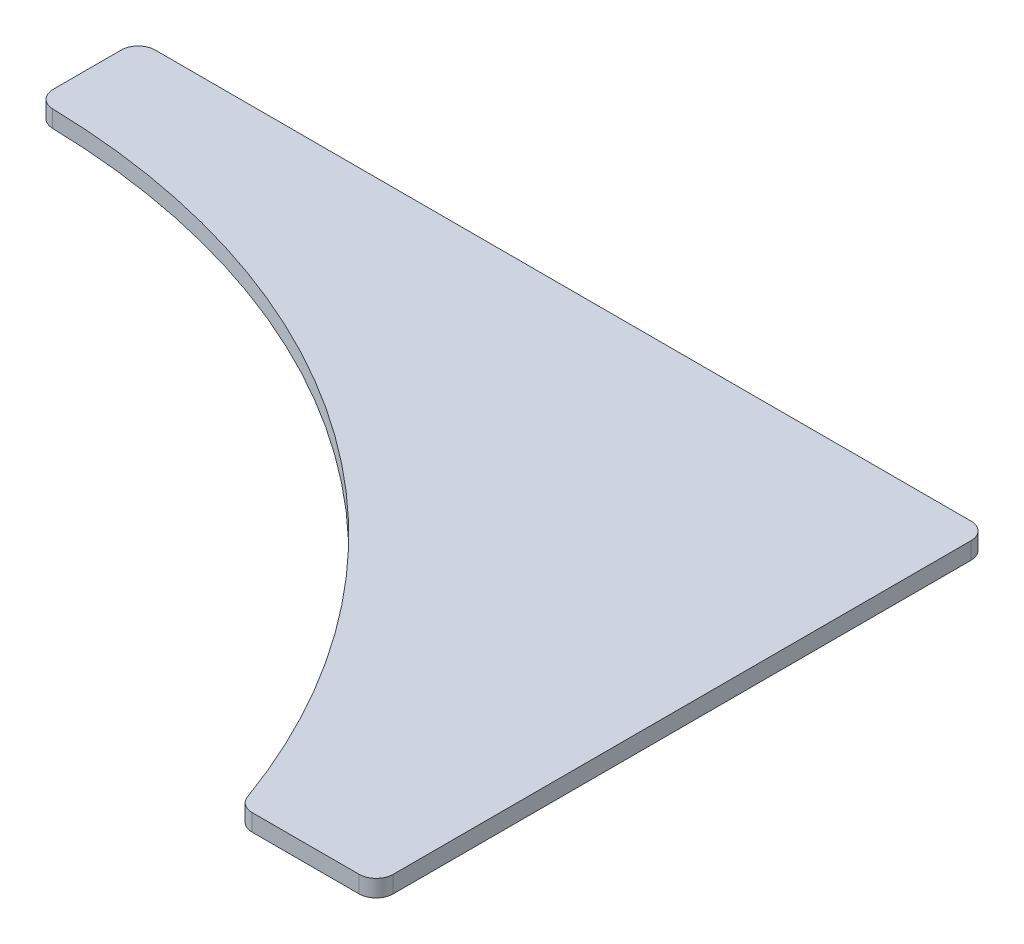
ISO-10303-21;
HEADER;
FILE_DESCRIPTION(('STEP AP214'),'2;1');
FILE_NAME('part.step','',(''),(''),'','','');
FILE_SCHEMA(('AUTOMOTIVE_DESIGN { 1 0 10303 214 1 1 1 1 }'));
ENDSEC;
DATA;
#1=APPLICATION_CONTEXT('core data for automotive mechanical design processes');
#2=APPLICATION_PROTOCOL_DEFINITION('international standard','automotive_design',2000,#1);
#3=PRODUCT_CONTEXT('',#1,'mechanical');
#4=PRODUCT('Part','Part','',(#3));
#5=PRODUCT_RELATED_PRODUCT_CATEGORY('part','',(#4));
#6=PRODUCT_DEFINITION_FORMATION('','',#4);
#7=PRODUCT_DEFINITION_CONTEXT('part definition',#1,'design');
#8=PRODUCT_DEFINITION('design','',#6,#7);
#9=PRODUCT_DEFINITION_SHAPE('','',#8);
#10=(LENGTH_UNIT() NAMED_UNIT(*) SI_UNIT(.MILLI.,.METRE.));
#11=(NAMED_UNIT(*) PLANE_ANGLE_UNIT() SI_UNIT($,.RADIAN.));
#12=(NAMED_UNIT(*) SI_UNIT($,.STERADIAN.) SOLID_ANGLE_UNIT());
#13=UNCERTAINTY_MEASURE_WITH_UNIT(LENGTH_MEASURE(1.E-05),#10,'distance_accuracy_value','');
#14=(GEOMETRIC_REPRESENTATION_CONTEXT(3) GLOBAL_UNCERTAINTY_ASSIGNED_CONTEXT((#13)) GLOBAL_UNIT_ASSIGNED_CONTEXT((#10,
#11,#12)) REPRESENTATION_CONTEXT('',''));
#15=CARTESIAN_POINT('',(0.,0.,0.));
#16=DIRECTION('',(0.,0.,1.));
#17=DIRECTION('',(1.,0.,0.));
#18=AXIS2_PLACEMENT_3D('',#15,#16,#17);
#19=CARTESIAN_POINT('',(-50.8,6.35,0.));
#20=DIRECTION('',(0.,0.,-1.));
#21=DIRECTION('',(-1.,0.,0.));
#22=AXIS2_PLACEMENT_3D('',#19,#20,#21);
#23=PLANE('',#22);
#24=DIRECTION('',(1.,0.,0.));
#25=VECTOR('',#24,1.);
#26=CARTESIAN_POINT('',(-50.8,6.35,0.));
#27=LINE('',#26,#25);
#28=CARTESIAN_POINT('',(-46.3022123984046,6.35,0.));
#29=VERTEX_POINT('',#28);
#30=CARTESIAN_POINT('',(-6.35,6.35,0.));
#31=VERTEX_POINT('',#30);
#32=EDGE_CURVE('E139',#29,#31,#27,.T.);
#33=ORIENTED_EDGE('',*,*,#32,.F.);
#34=DIRECTION('',(0.,-1.,0.));
#35=VECTOR('',#34,1.);
#36=CARTESIAN_POINT('',(-46.3022123984046,6.35,0.));
#37=LINE('',#36,#35);
#38=CARTESIAN_POINT('',(-46.3022123984046,0.,0.));
#39=VERTEX_POINT('',#38);
#40=EDGE_CURVE('E11',#29,#39,#37,.T.);
#41=ORIENTED_EDGE('',*,*,#40,.T.);
#42=DIRECTION('',(1.,0.,0.));
#43=VECTOR('',#42,1.);
#44=CARTESIAN_POINT('',(-50.8,0.,0.));
#45=LINE('',#44,#43);
#46=CARTESIAN_POINT('',(-6.35,0.,0.));
#47=VERTEX_POINT('',#46);
#48=EDGE_CURVE('E180',#39,#47,#45,.T.);
#49=ORIENTED_EDGE('',*,*,#48,.T.);
#50=DIRECTION('',(0.,-1.,0.));
#51=VECTOR('',#50,1.);
#52=CARTESIAN_POINT('',(-6.35,6.35,0.));
#53=LINE('',#52,#51);
#54=EDGE_CURVE('E41',#47,#31,#53,.F.);
#55=ORIENTED_EDGE('',*,*,#54,.T.);
#56=EDGE_LOOP('',(#33,#41,#49,#55));
#57=FACE_BOUND('',#56,.T.);
#58=ADVANCED_FACE('F33',(#57),#23,.F.);
#59=CARTESIAN_POINT('',(0.,6.35,0.));
#60=DIRECTION('',(-1.,0.,0.));
#61=DIRECTION('',(0.,0.,1.));
#62=AXIS2_PLACEMENT_3D('',#59,#60,#61);
#63=PLANE('',#62);
#64=DIRECTION('',(0.,0.,-1.));
#65=VECTOR('',#64,1.);
#66=CARTESIAN_POINT('',(0.,0.,0.));
#67=LINE('',#66,#65);
#68=CARTESIAN_POINT('',(0.,0.,-6.35));
#69=VERTEX_POINT('',#68);
#70=CARTESIAN_POINT('',(0.,0.,-222.25));
#71=VERTEX_POINT('',#70);
#72=EDGE_CURVE('E192',#69,#71,#67,.T.);
#73=ORIENTED_EDGE('',*,*,#72,.T.);
#74=DIRECTION('',(0.,-1.,0.));
#75=VECTOR('',#74,1.);
#76=CARTESIAN_POINT('',(0.,6.35,-222.25));
#77=LINE('',#76,#75);
#78=CARTESIAN_POINT('',(0.,6.35,-222.25));
#79=VERTEX_POINT('',#78);
#80=EDGE_CURVE('E174',#71,#79,#77,.F.);
#81=ORIENTED_EDGE('',*,*,#80,.T.);
#82=DIRECTION('',(0.,0.,-1.));
#83=VECTOR('',#82,1.);
#84=CARTESIAN_POINT('',(0.,6.35,0.));
#85=LINE('',#84,#83);
#86=CARTESIAN_POINT('',(0.,6.35,-6.35));
#87=VERTEX_POINT('',#86);
#88=EDGE_CURVE('E143',#87,#79,#85,.T.);
#89=ORIENTED_EDGE('',*,*,#88,.F.);
#90=DIRECTION('',(0.,-1.,0.));
#91=VECTOR('',#90,1.);
#92=CARTESIAN_POINT('',(0.,6.35,-6.35));
#93=LINE('',#92,#91);
#94=EDGE_CURVE('E171',#87,#69,#93,.T.);
#95=ORIENTED_EDGE('',*,*,#94,.T.);
#96=EDGE_LOOP('',(#73,#81,#89,#95));
#97=FACE_BOUND('',#96,.T.);
#98=ADVANCED_FACE('F191',(#97),#63,.F.);
#99=CARTESIAN_POINT('',(0.,6.35,-228.6));
#100=DIRECTION('',(0.,0.,1.));
#101=DIRECTION('',(1.,0.,0.));
#102=AXIS2_PLACEMENT_3D('',#99,#100,#101);
#103=PLANE('',#102);
#104=DIRECTION('',(-1.,0.,0.));
#105=VECTOR('',#104,1.);
#106=CARTESIAN_POINT('',(0.,0.,-228.6));
#107=LINE('',#106,#105);
#108=CARTESIAN_POINT('',(-6.35,0.,-228.6));
#109=VERTEX_POINT('',#108);
#110=CARTESIAN_POINT('',(-311.15,0.,-228.6));
#111=VERTEX_POINT('',#110);
#112=EDGE_CURVE('E145',#109,#111,#107,.T.);
#113=ORIENTED_EDGE('',*,*,#112,.T.);
#114=DIRECTION('',(0.,-1.,0.));
#115=VECTOR('',#114,1.);
#116=CARTESIAN_POINT('',(-311.15,6.35,-228.6));
#117=LINE('',#116,#115);
#118=CARTESIAN_POINT('',(-311.15,6.35,-228.6));
#119=VERTEX_POINT('',#118);
#120=EDGE_CURVE('E48',#111,#119,#117,.F.);
#121=ORIENTED_EDGE('',*,*,#120,.T.);
#122=DIRECTION('',(-1.,0.,0.));
#123=VECTOR('',#122,1.);
#124=CARTESIAN_POINT('',(0.,6.35,-228.6));
#125=LINE('',#124,#123);
#126=CARTESIAN_POINT('',(-6.35,6.35,-228.6));
#127=VERTEX_POINT('',#126);
#128=EDGE_CURVE('E201',#127,#119,#125,.T.);
#129=ORIENTED_EDGE('',*,*,#128,.F.);
#130=DIRECTION('',(0.,-1.,0.));
#131=VECTOR('',#130,1.);
#132=CARTESIAN_POINT('',(-6.35,6.35,-228.6));
#133=LINE('',#132,#131);
#134=EDGE_CURVE('E167',#127,#109,#133,.T.);
#135=ORIENTED_EDGE('',*,*,#134,.T.);
#136=EDGE_LOOP('',(#113,#121,#129,#135));
#137=FACE_BOUND('',#136,.T.);
#138=ADVANCED_FACE('F206',(#137),#103,.F.);
#139=CARTESIAN_POINT('',(-317.5,6.35,-228.6));
#140=DIRECTION('',(1.,0.,0.));
#141=DIRECTION('',(0.,0.,-1.));
#142=AXIS2_PLACEMENT_3D('',#139,#140,#141);
#143=PLANE('',#142);
#144=DIRECTION('',(0.,0.,1.));
#145=VECTOR('',#144,1.);
#146=CARTESIAN_POINT('',(-317.5,0.,-228.6));
#147=LINE('',#146,#145);
#148=CARTESIAN_POINT('',(-317.5,0.,-222.25));
#149=VERTEX_POINT('',#148);
#150=CARTESIAN_POINT('',(-317.5,0.,-196.780057594887));
#151=VERTEX_POINT('',#150);
#152=EDGE_CURVE('E140',#149,#151,#147,.T.);
#153=ORIENTED_EDGE('',*,*,#152,.T.);
#154=DIRECTION('',(0.,-1.,0.));
#155=VECTOR('',#154,1.);
#156=CARTESIAN_POINT('',(-317.5,6.35,-196.780057594887));
#157=LINE('',#156,#155);
#158=CARTESIAN_POINT('',(-317.5,6.35,-196.780057594887));
#159=VERTEX_POINT('',#158);
#160=EDGE_CURVE('E117',#151,#159,#157,.F.);
#161=ORIENTED_EDGE('',*,*,#160,.T.);
#162=DIRECTION('',(0.,0.,1.));
#163=VECTOR('',#162,1.);
#164=CARTESIAN_POINT('',(-317.5,6.35,-228.6));
#165=LINE('',#164,#163);
#166=CARTESIAN_POINT('',(-317.5,6.35,-222.25));
#167=VERTEX_POINT('',#166);
#168=EDGE_CURVE('E199',#167,#159,#165,.T.);
#169=ORIENTED_EDGE('',*,*,#168,.F.);
#170=DIRECTION('',(0.,-1.,0.));
#171=VECTOR('',#170,1.);
#172=CARTESIAN_POINT('',(-317.5,6.35,-222.25));
#173=LINE('',#172,#171);
#174=EDGE_CURVE('E122',#167,#149,#173,.T.);
#175=ORIENTED_EDGE('',*,*,#174,.T.);
#176=EDGE_LOOP('',(#153,#161,#169,#175));
#177=FACE_BOUND('',#176,.T.);
#178=ADVANCED_FACE('F213',(#177),#143,.F.);
#179=CARTESIAN_POINT('',(-317.5,6.35,91.4400000000001));
#180=DIRECTION('',(0.,-1.,0.));
#181=DIRECTION('',(0.,0.,-1.));
#182=AXIS2_PLACEMENT_3D('',#179,#180,#181);
#183=CYLINDRICAL_SURFACE('',#182,281.94);
#184=CARTESIAN_POINT('',(-317.5,6.35,91.4400000000001));
#185=DIRECTION('',(0.,-1.,0.));
#186=DIRECTION('',(0.,0.,-1.));
#187=AXIS2_PLACEMENT_3D('',#184,#185,#186);
#188=CIRCLE('',#187,281.94);
#189=CARTESIAN_POINT('',(-311.28986784141,6.35,-190.431598176497));
#190=VERTEX_POINT('',#189);
#191=CARTESIAN_POINT('',(-52.2757319491006,6.35,-4.19603524229073));
#192=VERTEX_POINT('',#191);
#193=EDGE_CURVE('E132',#190,#192,#188,.T.);
#194=ORIENTED_EDGE('',*,*,#193,.F.);
#195=DIRECTION('',(0.,-1.,0.));
#196=VECTOR('',#195,1.);
#197=CARTESIAN_POINT('',(-311.28986784141,6.35,-190.431598176497));
#198=LINE('',#197,#196);
#199=CARTESIAN_POINT('',(-311.28986784141,0.,-190.431598176497));
#200=VERTEX_POINT('',#199);
#201=EDGE_CURVE('E116',#190,#200,#198,.T.);
#202=ORIENTED_EDGE('',*,*,#201,.T.);
#203=CARTESIAN_POINT('',(-317.5,0.,91.4400000000001));
#204=DIRECTION('',(0.,-1.,0.));
#205=DIRECTION('',(0.,0.,-1.));
#206=AXIS2_PLACEMENT_3D('',#203,#204,#205);
#207=CIRCLE('',#206,281.94);
#208=CARTESIAN_POINT('',(-52.2757319491006,0.,-4.19603524229073));
#209=VERTEX_POINT('',#208);
#210=EDGE_CURVE('E129',#200,#209,#207,.T.);
#211=ORIENTED_EDGE('',*,*,#210,.T.);
#212=DIRECTION('',(0.,-1.,0.));
#213=VECTOR('',#212,1.);
#214=CARTESIAN_POINT('',(-52.2757319491005,6.35,-4.19603524229074));
#215=LINE('',#214,#213);
#216=EDGE_CURVE('E134',#209,#192,#215,.F.);
#217=ORIENTED_EDGE('',*,*,#216,.T.);
#218=EDGE_LOOP('',(#194,#202,#211,#217));
#219=FACE_BOUND('',#218,.T.);
#220=ADVANCED_FACE('F128',(#219),#183,.F.);
#221=CARTESIAN_POINT('',(-317.5,6.35,91.4400000000001));
#222=DIRECTION('',(0.,-1.,0.));
#223=DIRECTION('',(0.,0.,-1.));
#224=AXIS2_PLACEMENT_3D('',#221,#222,#223);
#225=PLANE('',#224);
#226=ORIENTED_EDGE('',*,*,#168,.T.);
#227=CARTESIAN_POINT('',(-311.15,6.35,-196.780057594887));
#228=DIRECTION('',(0.,-1.,0.));
#229=DIRECTION('',(0.,0.,-1.));
#230=AXIS2_PLACEMENT_3D('',#227,#228,#229);
#231=CIRCLE('',#230,6.35);
#232=EDGE_CURVE('E165',#159,#190,#231,.F.);
#233=ORIENTED_EDGE('',*,*,#232,.T.);
#234=ORIENTED_EDGE('',*,*,#193,.T.);
#235=CARTESIAN_POINT('',(-46.3022123984046,6.35,-6.34999999999999));
#236=DIRECTION('',(0.,-1.,0.));
#237=DIRECTION('',(0.,0.,-1.));
#238=AXIS2_PLACEMENT_3D('',#235,#236,#237);
#239=CIRCLE('',#238,6.35);
#240=EDGE_CURVE('E160',#192,#29,#239,.F.);
#241=ORIENTED_EDGE('',*,*,#240,.T.);
#242=ORIENTED_EDGE('',*,*,#32,.T.);
#243=CARTESIAN_POINT('',(-6.35,6.35,-6.35));
#244=DIRECTION('',(0.,-1.,0.));
#245=DIRECTION('',(0.,0.,-1.));
#246=AXIS2_PLACEMENT_3D('',#243,#244,#245);
#247=CIRCLE('',#246,6.35);
#248=EDGE_CURVE('E158',#31,#87,#247,.F.);
#249=ORIENTED_EDGE('',*,*,#248,.T.);
#250=ORIENTED_EDGE('',*,*,#88,.T.);
#251=CARTESIAN_POINT('',(-6.35,6.35,-222.25));
#252=DIRECTION('',(0.,-1.,0.));
#253=DIRECTION('',(0.,0.,-1.));
#254=AXIS2_PLACEMENT_3D('',#251,#252,#253);
#255=CIRCLE('',#254,6.35);
#256=EDGE_CURVE('E55',#79,#127,#255,.F.);
#257=ORIENTED_EDGE('',*,*,#256,.T.);
#258=ORIENTED_EDGE('',*,*,#128,.T.);
#259=CARTESIAN_POINT('',(-311.15,6.35,-222.25));
#260=DIRECTION('',(0.,-1.,0.));
#261=DIRECTION('',(0.,0.,-1.));
#262=AXIS2_PLACEMENT_3D('',#259,#260,#261);
#263=CIRCLE('',#262,6.35);
#264=EDGE_CURVE('E163',#119,#167,#263,.F.);
#265=ORIENTED_EDGE('',*,*,#264,.T.);
#266=EDGE_LOOP('',(#226,#233,#234,#241,#242,#249,#250,#257,#258,#265));
#267=FACE_BOUND('',#266,.T.);
#268=ADVANCED_FACE('F184',(#267),#225,.F.);
#269=CARTESIAN_POINT('',(-317.5,0.,91.4400000000001));
#270=DIRECTION('',(0.,-1.,0.));
#271=DIRECTION('',(0.,0.,-1.));
#272=AXIS2_PLACEMENT_3D('',#269,#270,#271);
#273=PLANE('',#272);
#274=ORIENTED_EDGE('',*,*,#210,.F.);
#275=CARTESIAN_POINT('',(-311.15,0.,-196.780057594887));
#276=DIRECTION('',(0.,-1.,0.));
#277=DIRECTION('',(0.,0.,-1.));
#278=AXIS2_PLACEMENT_3D('',#275,#276,#277);
#279=CIRCLE('',#278,6.35);
#280=EDGE_CURVE('E112',#200,#151,#279,.T.);
#281=ORIENTED_EDGE('',*,*,#280,.T.);
#282=ORIENTED_EDGE('',*,*,#152,.F.);
#283=CARTESIAN_POINT('',(-311.15,0.,-222.25));
#284=DIRECTION('',(0.,-1.,0.));
#285=DIRECTION('',(0.,0.,-1.));
#286=AXIS2_PLACEMENT_3D('',#283,#284,#285);
#287=CIRCLE('',#286,6.35);
#288=EDGE_CURVE('E123',#149,#111,#287,.T.);
#289=ORIENTED_EDGE('',*,*,#288,.T.);
#290=ORIENTED_EDGE('',*,*,#112,.F.);
#291=CARTESIAN_POINT('',(-6.35,0.,-222.25));
#292=DIRECTION('',(0.,-1.,0.));
#293=DIRECTION('',(0.,0.,-1.));
#294=AXIS2_PLACEMENT_3D('',#291,#292,#293);
#295=CIRCLE('',#294,6.35);
#296=EDGE_CURVE('E152',#109,#71,#295,.T.);
#297=ORIENTED_EDGE('',*,*,#296,.T.);
#298=ORIENTED_EDGE('',*,*,#72,.F.);
#299=CARTESIAN_POINT('',(-6.35,0.,-6.35));
#300=DIRECTION('',(0.,-1.,0.));
#301=DIRECTION('',(0.,0.,-1.));
#302=AXIS2_PLACEMENT_3D('',#299,#300,#301);
#303=CIRCLE('',#302,6.35);
#304=EDGE_CURVE('E133',#69,#47,#303,.T.);
#305=ORIENTED_EDGE('',*,*,#304,.T.);
#306=ORIENTED_EDGE('',*,*,#48,.F.);
#307=CARTESIAN_POINT('',(-46.3022123984046,0.,-6.34999999999999));
#308=DIRECTION('',(0.,-1.,0.));
#309=DIRECTION('',(0.,0.,-1.));
#310=AXIS2_PLACEMENT_3D('',#307,#308,#309);
#311=CIRCLE('',#310,6.35);
#312=EDGE_CURVE('E138',#39,#209,#311,.T.);
#313=ORIENTED_EDGE('',*,*,#312,.T.);
#314=EDGE_LOOP('',(#274,#281,#282,#289,#290,#297,#298,#305,#306,#313));
#315=FACE_BOUND('',#314,.T.);
#316=ADVANCED_FACE('F136',(#315),#273,.T.);
#317=CARTESIAN_POINT('',(-311.15,6.35,-196.780057594887));
#318=DIRECTION('',(0.,-1.,0.));
#319=DIRECTION('',(0.,0.,-1.));
#320=AXIS2_PLACEMENT_3D('',#317,#318,#319);
#321=CYLINDRICAL_SURFACE('',#320,6.35);
#322=ORIENTED_EDGE('',*,*,#232,.F.);
#323=ORIENTED_EDGE('',*,*,#160,.F.);
#324=ORIENTED_EDGE('',*,*,#280,.F.);
#325=ORIENTED_EDGE('',*,*,#201,.F.);
#326=EDGE_LOOP('',(#322,#323,#324,#325));
#327=FACE_BOUND('',#326,.T.);
#328=ADVANCED_FACE('F115',(#327),#321,.T.);
#329=CARTESIAN_POINT('',(-311.15,6.35,-222.25));
#330=DIRECTION('',(0.,-1.,0.));
#331=DIRECTION('',(0.,0.,-1.));
#332=AXIS2_PLACEMENT_3D('',#329,#330,#331);
#333=CYLINDRICAL_SURFACE('',#332,6.35);
#334=ORIENTED_EDGE('',*,*,#264,.F.);
#335=ORIENTED_EDGE('',*,*,#120,.F.);
#336=ORIENTED_EDGE('',*,*,#288,.F.);
#337=ORIENTED_EDGE('',*,*,#174,.F.);
#338=EDGE_LOOP('',(#334,#335,#336,#337));
#339=FACE_BOUND('',#338,.T.);
#340=ADVANCED_FACE('F210',(#339),#333,.T.);
#341=CARTESIAN_POINT('',(-6.35,6.35,-222.25));
#342=DIRECTION('',(0.,-1.,0.));
#343=DIRECTION('',(0.,0.,-1.));
#344=AXIS2_PLACEMENT_3D('',#341,#342,#343);
#345=CYLINDRICAL_SURFACE('',#344,6.35);
#346=ORIENTED_EDGE('',*,*,#256,.F.);
#347=ORIENTED_EDGE('',*,*,#80,.F.);
#348=ORIENTED_EDGE('',*,*,#296,.F.);
#349=ORIENTED_EDGE('',*,*,#134,.F.);
#350=EDGE_LOOP('',(#346,#347,#348,#349));
#351=FACE_BOUND('',#350,.T.);
#352=ADVANCED_FACE('F205',(#351),#345,.T.);
#353=CARTESIAN_POINT('',(-46.3022123984046,6.35,-6.34999999999999));
#354=DIRECTION('',(0.,-1.,0.));
#355=DIRECTION('',(0.,0.,-1.));
#356=AXIS2_PLACEMENT_3D('',#353,#354,#355);
#357=CYLINDRICAL_SURFACE('',#356,6.35);
#358=ORIENTED_EDGE('',*,*,#240,.F.);
#359=ORIENTED_EDGE('',*,*,#216,.F.);
#360=ORIENTED_EDGE('',*,*,#312,.F.);
#361=ORIENTED_EDGE('',*,*,#40,.F.);
#362=EDGE_LOOP('',(#358,#359,#360,#361));
#363=FACE_BOUND('',#362,.T.);
#364=ADVANCED_FACE('F215',(#363),#357,.T.);
#365=CARTESIAN_POINT('',(-6.35,6.35,-6.35));
#366=DIRECTION('',(0.,-1.,0.));
#367=DIRECTION('',(0.,0.,-1.));
#368=AXIS2_PLACEMENT_3D('',#365,#366,#367);
#369=CYLINDRICAL_SURFACE('',#368,6.35);
#370=ORIENTED_EDGE('',*,*,#248,.F.);
#371=ORIENTED_EDGE('',*,*,#54,.F.);
#372=ORIENTED_EDGE('',*,*,#304,.F.);
#373=ORIENTED_EDGE('',*,*,#94,.F.);
#374=EDGE_LOOP('',(#370,#371,#372,#373));
#375=FACE_BOUND('',#374,.T.);
#376=ADVANCED_FACE('F35',(#375),#369,.T.);
#377=CLOSED_SHELL('',(#58,#98,#138,#178,#220,#268,#316,#328,#340,#352,#364,#376));
#378=MANIFOLD_SOLID_BREP('B2',#377);
#379=ADVANCED_BREP_SHAPE_REPRESENTATION('',(#18,#378),#14);
#380=SHAPE_DEFINITION_REPRESENTATION(#9,#379);
ENDSEC;
END-ISO-10303-21;
